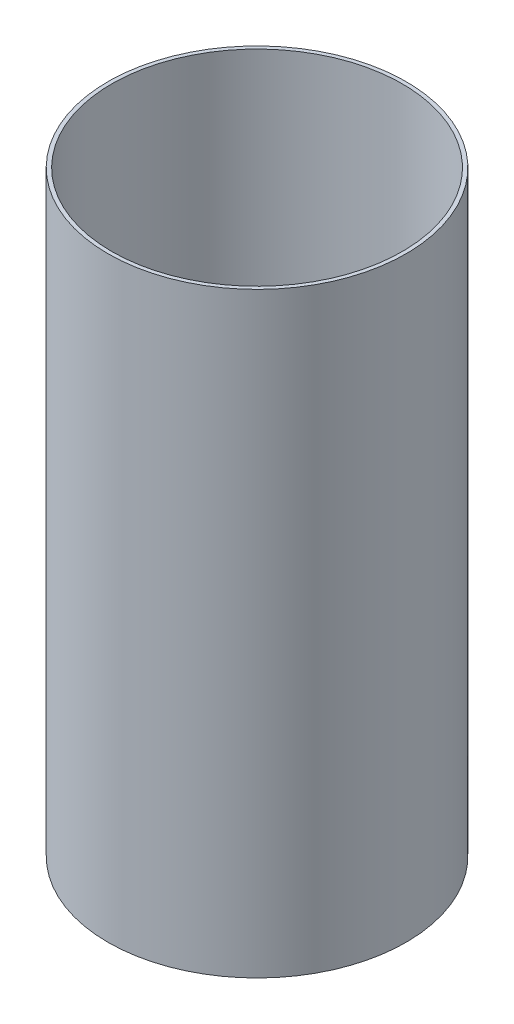
ISO-10303-21;
HEADER;
FILE_DESCRIPTION(('STEP AP214'),'2;1');
FILE_NAME('part.step','',(''),(''),'','','');
FILE_SCHEMA(('AUTOMOTIVE_DESIGN { 1 0 10303 214 1 1 1 1 }'));
ENDSEC;
DATA;
#1=APPLICATION_CONTEXT('core data for automotive mechanical design processes');
#2=APPLICATION_PROTOCOL_DEFINITION('international standard','automotive_design',2000,#1);
#3=PRODUCT_CONTEXT('',#1,'mechanical');
#4=PRODUCT('Part','Part','',(#3));
#5=PRODUCT_RELATED_PRODUCT_CATEGORY('part','',(#4));
#6=PRODUCT_DEFINITION_FORMATION('','',#4);
#7=PRODUCT_DEFINITION_CONTEXT('part definition',#1,'design');
#8=PRODUCT_DEFINITION('design','',#6,#7);
#9=PRODUCT_DEFINITION_SHAPE('','',#8);
#10=(LENGTH_UNIT() NAMED_UNIT(*) SI_UNIT(.MILLI.,.METRE.));
#11=(NAMED_UNIT(*) PLANE_ANGLE_UNIT() SI_UNIT($,.RADIAN.));
#12=(NAMED_UNIT(*) SI_UNIT($,.STERADIAN.) SOLID_ANGLE_UNIT());
#13=UNCERTAINTY_MEASURE_WITH_UNIT(LENGTH_MEASURE(1.E-05),#10,'distance_accuracy_value','');
#14=(GEOMETRIC_REPRESENTATION_CONTEXT(3) GLOBAL_UNCERTAINTY_ASSIGNED_CONTEXT((#13)) GLOBAL_UNIT_ASSIGNED_CONTEXT((#10,
#11,#12)) REPRESENTATION_CONTEXT('',''));
#15=CARTESIAN_POINT('',(0.,0.,0.));
#16=DIRECTION('',(0.,0.,1.));
#17=DIRECTION('',(1.,0.,0.));
#18=AXIS2_PLACEMENT_3D('',#15,#16,#17);
#19=CARTESIAN_POINT('',(0.,-150.,0.));
#20=DIRECTION('',(0.,1.,0.));
#21=DIRECTION('',(0.,0.,1.));
#22=AXIS2_PLACEMENT_3D('',#19,#20,#21);
#23=PLANE('',#22);
#24=CARTESIAN_POINT('',(0.,-150.,0.));
#25=DIRECTION('',(0.,1.,0.));
#26=DIRECTION('',(0.,0.,1.));
#27=AXIS2_PLACEMENT_3D('',#24,#25,#26);
#28=CIRCLE('',#27,75.);
#29=CARTESIAN_POINT('',(0.,-150.,75.));
#30=VERTEX_POINT('',#29);
#31=EDGE_CURVE('E10',#30,#30,#28,.T.);
#32=ORIENTED_EDGE('',*,*,#31,.F.);
#33=EDGE_LOOP('',(#32));
#34=FACE_BOUND('',#33,.T.);
#35=CARTESIAN_POINT('',(0.,-150.,0.));
#36=DIRECTION('',(0.,1.,0.));
#37=DIRECTION('',(0.,0.,1.));
#38=AXIS2_PLACEMENT_3D('',#35,#36,#37);
#39=CIRCLE('',#38,73.0854526815443);
#40=CARTESIAN_POINT('',(0.,-150.,73.0854526815443));
#41=VERTEX_POINT('',#40);
#42=EDGE_CURVE('E43',#41,#41,#39,.F.);
#43=ORIENTED_EDGE('',*,*,#42,.F.);
#44=EDGE_LOOP('',(#43));
#45=FACE_BOUND('',#44,.T.);
#46=ADVANCED_FACE('F31',(#34,#45),#23,.F.);
#47=CARTESIAN_POINT('',(0.,150.,0.));
#48=DIRECTION('',(0.,1.,0.));
#49=DIRECTION('',(0.,0.,1.));
#50=AXIS2_PLACEMENT_3D('',#47,#48,#49);
#51=PLANE('',#50);
#52=CARTESIAN_POINT('',(0.,150.,0.));
#53=DIRECTION('',(0.,1.,0.));
#54=DIRECTION('',(0.,0.,1.));
#55=AXIS2_PLACEMENT_3D('',#52,#53,#54);
#56=CIRCLE('',#55,75.);
#57=CARTESIAN_POINT('',(0.,150.,75.));
#58=VERTEX_POINT('',#57);
#59=EDGE_CURVE('E39',#58,#58,#56,.T.);
#60=ORIENTED_EDGE('',*,*,#59,.T.);
#61=EDGE_LOOP('',(#60));
#62=FACE_BOUND('',#61,.T.);
#63=CARTESIAN_POINT('',(0.,150.,0.));
#64=DIRECTION('',(0.,1.,0.));
#65=DIRECTION('',(0.,0.,1.));
#66=AXIS2_PLACEMENT_3D('',#63,#64,#65);
#67=CIRCLE('',#66,73.0854526815443);
#68=CARTESIAN_POINT('',(0.,150.,73.0854526815443));
#69=VERTEX_POINT('',#68);
#70=EDGE_CURVE('E35',#69,#69,#67,.F.);
#71=ORIENTED_EDGE('',*,*,#70,.T.);
#72=EDGE_LOOP('',(#71));
#73=FACE_BOUND('',#72,.T.);
#74=ADVANCED_FACE('F52',(#62,#73),#51,.T.);
#75=CARTESIAN_POINT('',(0.,-150.,0.));
#76=DIRECTION('',(0.,1.,0.));
#77=DIRECTION('',(0.,0.,1.));
#78=AXIS2_PLACEMENT_3D('',#75,#76,#77);
#79=CYLINDRICAL_SURFACE('',#78,75.);
#80=ORIENTED_EDGE('',*,*,#31,.T.);
#81=EDGE_LOOP('',(#80));
#82=FACE_BOUND('',#81,.T.);
#83=ORIENTED_EDGE('',*,*,#59,.F.);
#84=EDGE_LOOP('',(#83));
#85=FACE_BOUND('',#84,.T.);
#86=ADVANCED_FACE('F33',(#82,#85),#79,.T.);
#87=CARTESIAN_POINT('',(0.,160.,0.));
#88=DIRECTION('',(0.,-1.,0.));
#89=DIRECTION('',(0.,0.,-1.));
#90=AXIS2_PLACEMENT_3D('',#87,#88,#89);
#91=CYLINDRICAL_SURFACE('',#90,73.0854526815443);
#92=ORIENTED_EDGE('',*,*,#70,.F.);
#93=EDGE_LOOP('',(#92));
#94=FACE_BOUND('',#93,.T.);
#95=ORIENTED_EDGE('',*,*,#42,.T.);
#96=EDGE_LOOP('',(#95));
#97=FACE_BOUND('',#96,.T.);
#98=ADVANCED_FACE('F54',(#94,#97),#91,.F.);
#99=CLOSED_SHELL('',(#46,#74,#86,#98));
#100=MANIFOLD_SOLID_BREP('B2',#99);
#101=ADVANCED_BREP_SHAPE_REPRESENTATION('',(#18,#100),#14);
#102=SHAPE_DEFINITION_REPRESENTATION(#9,#101);
ENDSEC;
END-ISO-10303-21;
